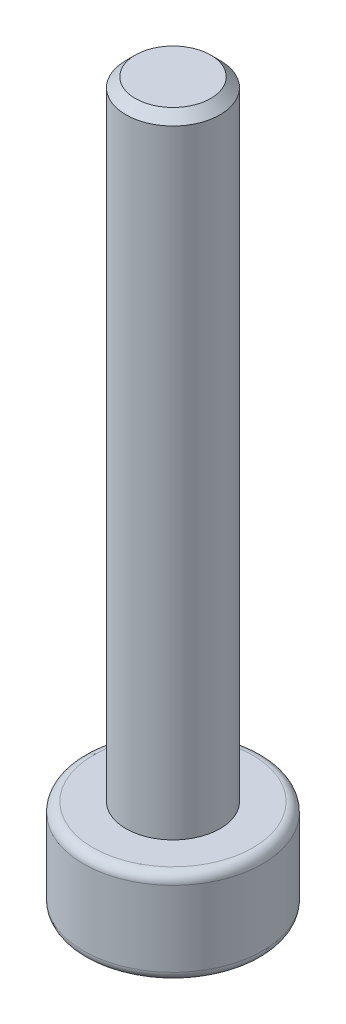
ISO-10303-21;
HEADER;
FILE_DESCRIPTION(('STEP AP214'),'2;1');
FILE_NAME('part.step','',(''),(''),'','','');
FILE_SCHEMA(('AUTOMOTIVE_DESIGN { 1 0 10303 214 1 1 1 1 }'));
ENDSEC;
DATA;
#1=APPLICATION_CONTEXT('core data for automotive mechanical design processes');
#2=APPLICATION_PROTOCOL_DEFINITION('international standard','automotive_design',2000,#1);
#3=PRODUCT_CONTEXT('',#1,'mechanical');
#4=PRODUCT('Part','Part','',(#3));
#5=PRODUCT_RELATED_PRODUCT_CATEGORY('part','',(#4));
#6=PRODUCT_DEFINITION_FORMATION('','',#4);
#7=PRODUCT_DEFINITION_CONTEXT('part definition',#1,'design');
#8=PRODUCT_DEFINITION('design','',#6,#7);
#9=PRODUCT_DEFINITION_SHAPE('','',#8);
#10=(LENGTH_UNIT() NAMED_UNIT(*) SI_UNIT(.MILLI.,.METRE.));
#11=(NAMED_UNIT(*) PLANE_ANGLE_UNIT() SI_UNIT($,.RADIAN.));
#12=(NAMED_UNIT(*) SI_UNIT($,.STERADIAN.) SOLID_ANGLE_UNIT());
#13=UNCERTAINTY_MEASURE_WITH_UNIT(LENGTH_MEASURE(1.E-05),#10,'distance_accuracy_value','');
#14=(GEOMETRIC_REPRESENTATION_CONTEXT(3) GLOBAL_UNCERTAINTY_ASSIGNED_CONTEXT((#13)) GLOBAL_UNIT_ASSIGNED_CONTEXT((#10,
#11,#12)) REPRESENTATION_CONTEXT('',''));
#15=CARTESIAN_POINT('',(0.,0.,0.));
#16=DIRECTION('',(0.,0.,1.));
#17=DIRECTION('',(1.,0.,0.));
#18=AXIS2_PLACEMENT_3D('',#15,#16,#17);
#19=CARTESIAN_POINT('',(0.,3.,0.));
#20=DIRECTION('',(0.,-1.,0.));
#21=DIRECTION('',(0.,0.,-1.));
#22=AXIS2_PLACEMENT_3D('',#19,#20,#21);
#23=CYLINDRICAL_SURFACE('',#22,2.85);
#24=CARTESIAN_POINT('',(0.,2.7,0.));
#25=DIRECTION('',(0.,1.,0.));
#26=DIRECTION('',(0.,0.,1.));
#27=AXIS2_PLACEMENT_3D('',#24,#25,#26);
#28=CIRCLE('',#27,2.85);
#29=CARTESIAN_POINT('',(0.,2.7,2.85));
#30=VERTEX_POINT('',#29);
#31=EDGE_CURVE('E68',#30,#30,#28,.F.);
#32=ORIENTED_EDGE('',*,*,#31,.T.);
#33=EDGE_LOOP('',(#32));
#34=FACE_BOUND('',#33,.T.);
#35=CARTESIAN_POINT('',(0.,0.3,0.));
#36=DIRECTION('',(0.,1.,0.));
#37=DIRECTION('',(0.,0.,1.));
#38=AXIS2_PLACEMENT_3D('',#35,#36,#37);
#39=CIRCLE('',#38,2.85);
#40=CARTESIAN_POINT('',(0.,0.3,2.85));
#41=VERTEX_POINT('',#40);
#42=EDGE_CURVE('E72',#41,#41,#39,.T.);
#43=ORIENTED_EDGE('',*,*,#42,.T.);
#44=EDGE_LOOP('',(#43));
#45=FACE_BOUND('',#44,.T.);
#46=ADVANCED_FACE('F39',(#34,#45),#23,.T.);
#47=CARTESIAN_POINT('',(0.,3.,0.));
#48=DIRECTION('',(0.,1.,0.));
#49=DIRECTION('',(0.,0.,1.));
#50=AXIS2_PLACEMENT_3D('',#47,#48,#49);
#51=PLANE('',#50);
#52=CARTESIAN_POINT('',(0.,3.,0.));
#53=DIRECTION('',(0.,1.,0.));
#54=DIRECTION('',(0.,0.,1.));
#55=AXIS2_PLACEMENT_3D('',#52,#53,#54);
#56=CIRCLE('',#55,2.55);
#57=CARTESIAN_POINT('',(0.,3.,2.55));
#58=VERTEX_POINT('',#57);
#59=EDGE_CURVE('E76',#58,#58,#56,.T.);
#60=ORIENTED_EDGE('',*,*,#59,.T.);
#61=EDGE_LOOP('',(#60));
#62=FACE_BOUND('',#61,.T.);
#63=CARTESIAN_POINT('',(0.,3.,0.));
#64=DIRECTION('',(0.,1.,0.));
#65=DIRECTION('',(0.,0.,1.));
#66=AXIS2_PLACEMENT_3D('',#63,#64,#65);
#67=CIRCLE('',#66,1.5);
#68=CARTESIAN_POINT('',(0.,3.,1.5));
#69=VERTEX_POINT('',#68);
#70=EDGE_CURVE('E80',#69,#69,#67,.T.);
#71=ORIENTED_EDGE('',*,*,#70,.F.);
#72=EDGE_LOOP('',(#71));
#73=FACE_BOUND('',#72,.T.);
#74=ADVANCED_FACE('F105',(#62,#73),#51,.T.);
#75=CARTESIAN_POINT('',(0.,0.,0.));
#76=DIRECTION('',(0.,1.,0.));
#77=DIRECTION('',(0.,0.,1.));
#78=AXIS2_PLACEMENT_3D('',#75,#76,#77);
#79=PLANE('',#78);
#80=CARTESIAN_POINT('',(0.,0.,0.));
#81=DIRECTION('',(0.,1.,0.));
#82=DIRECTION('',(0.,0.,1.));
#83=AXIS2_PLACEMENT_3D('',#80,#81,#82);
#84=CIRCLE('',#83,1.44);
#85=CARTESIAN_POINT('',(0.,0.,1.44));
#86=VERTEX_POINT('',#85);
#87=EDGE_CURVE('E10',#86,#86,#84,.T.);
#88=ORIENTED_EDGE('',*,*,#87,.T.);
#89=EDGE_LOOP('',(#88));
#90=FACE_BOUND('',#89,.T.);
#91=CARTESIAN_POINT('',(0.,0.,0.));
#92=DIRECTION('',(0.,1.,0.));
#93=DIRECTION('',(0.,0.,1.));
#94=AXIS2_PLACEMENT_3D('',#91,#92,#93);
#95=CIRCLE('',#94,2.55);
#96=CARTESIAN_POINT('',(0.,0.,2.55));
#97=VERTEX_POINT('',#96);
#98=EDGE_CURVE('E64',#97,#97,#95,.F.);
#99=ORIENTED_EDGE('',*,*,#98,.T.);
#100=EDGE_LOOP('',(#99));
#101=FACE_BOUND('',#100,.T.);
#102=ADVANCED_FACE('F111',(#90,#101),#79,.F.);
#103=CARTESIAN_POINT('',(0.,23.,0.));
#104=DIRECTION('',(0.,-1.,0.));
#105=DIRECTION('',(0.,0.,-1.));
#106=AXIS2_PLACEMENT_3D('',#103,#104,#105);
#107=CYLINDRICAL_SURFACE('',#106,1.5);
#108=CARTESIAN_POINT('',(0.,22.7,0.));
#109=DIRECTION('',(0.,1.,0.));
#110=DIRECTION('',(0.,0.,1.));
#111=AXIS2_PLACEMENT_3D('',#108,#109,#110);
#112=CIRCLE('',#111,1.5);
#113=CARTESIAN_POINT('',(0.,22.7,1.5));
#114=VERTEX_POINT('',#113);
#115=EDGE_CURVE('E53',#114,#114,#112,.F.);
#116=ORIENTED_EDGE('',*,*,#115,.T.);
#117=EDGE_LOOP('',(#116));
#118=FACE_BOUND('',#117,.T.);
#119=ORIENTED_EDGE('',*,*,#70,.T.);
#120=EDGE_LOOP('',(#119));
#121=FACE_BOUND('',#120,.T.);
#122=ADVANCED_FACE('F101',(#118,#121),#107,.T.);
#123=CARTESIAN_POINT('',(0.,23.,0.));
#124=DIRECTION('',(0.,1.,0.));
#125=DIRECTION('',(0.,0.,1.));
#126=AXIS2_PLACEMENT_3D('',#123,#124,#125);
#127=PLANE('',#126);
#128=CARTESIAN_POINT('',(0.,23.,0.));
#129=DIRECTION('',(0.,1.,0.));
#130=DIRECTION('',(0.,0.,1.));
#131=AXIS2_PLACEMENT_3D('',#128,#129,#130);
#132=CIRCLE('',#131,1.2);
#133=CARTESIAN_POINT('',(0.,23.,1.2));
#134=VERTEX_POINT('',#133);
#135=EDGE_CURVE('E58',#134,#134,#132,.T.);
#136=ORIENTED_EDGE('',*,*,#135,.T.);
#137=EDGE_LOOP('',(#136));
#138=FACE_BOUND('',#137,.T.);
#139=ADVANCED_FACE('F93',(#138),#127,.T.);
#140=CARTESIAN_POINT('',(0.,1.3,0.));
#141=DIRECTION('',(0.,-1.,0.));
#142=DIRECTION('',(0.,0.,-1.));
#143=AXIS2_PLACEMENT_3D('',#140,#141,#142);
#144=CYLINDRICAL_SURFACE('',#143,1.29);
#145=CARTESIAN_POINT('',(0.,0.149999999999998,0.));
#146=DIRECTION('',(0.,1.,0.));
#147=DIRECTION('',(0.,0.,1.));
#148=AXIS2_PLACEMENT_3D('',#145,#146,#147);
#149=CIRCLE('',#148,1.29);
#150=CARTESIAN_POINT('',(0.,0.149999999999998,1.29));
#151=VERTEX_POINT('',#150);
#152=EDGE_CURVE('E48',#151,#151,#149,.F.);
#153=ORIENTED_EDGE('',*,*,#152,.T.);
#154=EDGE_LOOP('',(#153));
#155=FACE_BOUND('',#154,.T.);
#156=CARTESIAN_POINT('',(0.,1.3,0.));
#157=DIRECTION('',(0.,-1.,0.));
#158=DIRECTION('',(0.,0.,-1.));
#159=AXIS2_PLACEMENT_3D('',#156,#157,#158);
#160=CIRCLE('',#159,1.29);
#161=CARTESIAN_POINT('',(0.,1.3,-1.29));
#162=VERTEX_POINT('',#161);
#163=EDGE_CURVE('E84',#162,#162,#160,.T.);
#164=ORIENTED_EDGE('',*,*,#163,.F.);
#165=EDGE_LOOP('',(#164));
#166=FACE_BOUND('',#165,.T.);
#167=ADVANCED_FACE('F91',(#155,#166),#144,.F.);
#168=CARTESIAN_POINT('',(0.,1.3,0.));
#169=DIRECTION('',(0.,-1.,0.));
#170=DIRECTION('',(0.,0.,-1.));
#171=AXIS2_PLACEMENT_3D('',#168,#169,#170);
#172=PLANE('',#171);
#173=ORIENTED_EDGE('',*,*,#163,.T.);
#174=EDGE_LOOP('',(#173));
#175=FACE_BOUND('',#174,.T.);
#176=ADVANCED_FACE('F89',(#175),#172,.T.);
#177=CARTESIAN_POINT('',(0.,2.7,0.));
#178=DIRECTION('',(0.,1.,0.));
#179=DIRECTION('',(0.,0.,1.));
#180=AXIS2_PLACEMENT_3D('',#177,#178,#179);
#181=TOROIDAL_SURFACE('',#180,2.55,0.3);
#182=ORIENTED_EDGE('',*,*,#31,.F.);
#183=EDGE_LOOP('',(#182));
#184=FACE_BOUND('',#183,.T.);
#185=ORIENTED_EDGE('',*,*,#59,.F.);
#186=EDGE_LOOP('',(#185));
#187=FACE_BOUND('',#186,.T.);
#188=ADVANCED_FACE('F99',(#184,#187),#181,.T.);
#189=CARTESIAN_POINT('',(0.,0.3,0.));
#190=DIRECTION('',(0.,1.,0.));
#191=DIRECTION('',(0.,0.,1.));
#192=AXIS2_PLACEMENT_3D('',#189,#190,#191);
#193=TOROIDAL_SURFACE('',#192,2.55,0.3);
#194=ORIENTED_EDGE('',*,*,#98,.F.);
#195=EDGE_LOOP('',(#194));
#196=FACE_BOUND('',#195,.T.);
#197=ORIENTED_EDGE('',*,*,#42,.F.);
#198=EDGE_LOOP('',(#197));
#199=FACE_BOUND('',#198,.T.);
#200=ADVANCED_FACE('F119',(#196,#199),#193,.T.);
#201=CARTESIAN_POINT('',(0.,23.,0.));
#202=DIRECTION('',(0.,-1.,0.));
#203=DIRECTION('',(0.,0.,-1.));
#204=AXIS2_PLACEMENT_3D('',#201,#202,#203);
#205=CONICAL_SURFACE('',#204,1.2,0.785398163397452);
#206=ORIENTED_EDGE('',*,*,#115,.F.);
#207=EDGE_LOOP('',(#206));
#208=FACE_BOUND('',#207,.T.);
#209=ORIENTED_EDGE('',*,*,#135,.F.);
#210=EDGE_LOOP('',(#209));
#211=FACE_BOUND('',#210,.T.);
#212=ADVANCED_FACE('F122',(#208,#211),#205,.T.);
#213=CARTESIAN_POINT('',(0.,0.149999999999998,0.));
#214=DIRECTION('',(0.,-1.,0.));
#215=DIRECTION('',(0.,0.,-1.));
#216=AXIS2_PLACEMENT_3D('',#213,#214,#215);
#217=CONICAL_SURFACE('',#216,1.29,0.785398163397445);
#218=ORIENTED_EDGE('',*,*,#87,.F.);
#219=EDGE_LOOP('',(#218));
#220=FACE_BOUND('',#219,.T.);
#221=ORIENTED_EDGE('',*,*,#152,.F.);
#222=EDGE_LOOP('',(#221));
#223=FACE_BOUND('',#222,.T.);
#224=ADVANCED_FACE('F42',(#220,#223),#217,.F.);
#225=CLOSED_SHELL('',(#46,#74,#102,#122,#139,#167,#176,#188,#200,#212,#224));
#226=MANIFOLD_SOLID_BREP('B2',#225);
#227=ADVANCED_BREP_SHAPE_REPRESENTATION('',(#18,#226),#14);
#228=SHAPE_DEFINITION_REPRESENTATION(#9,#227);
ENDSEC;
END-ISO-10303-21;
